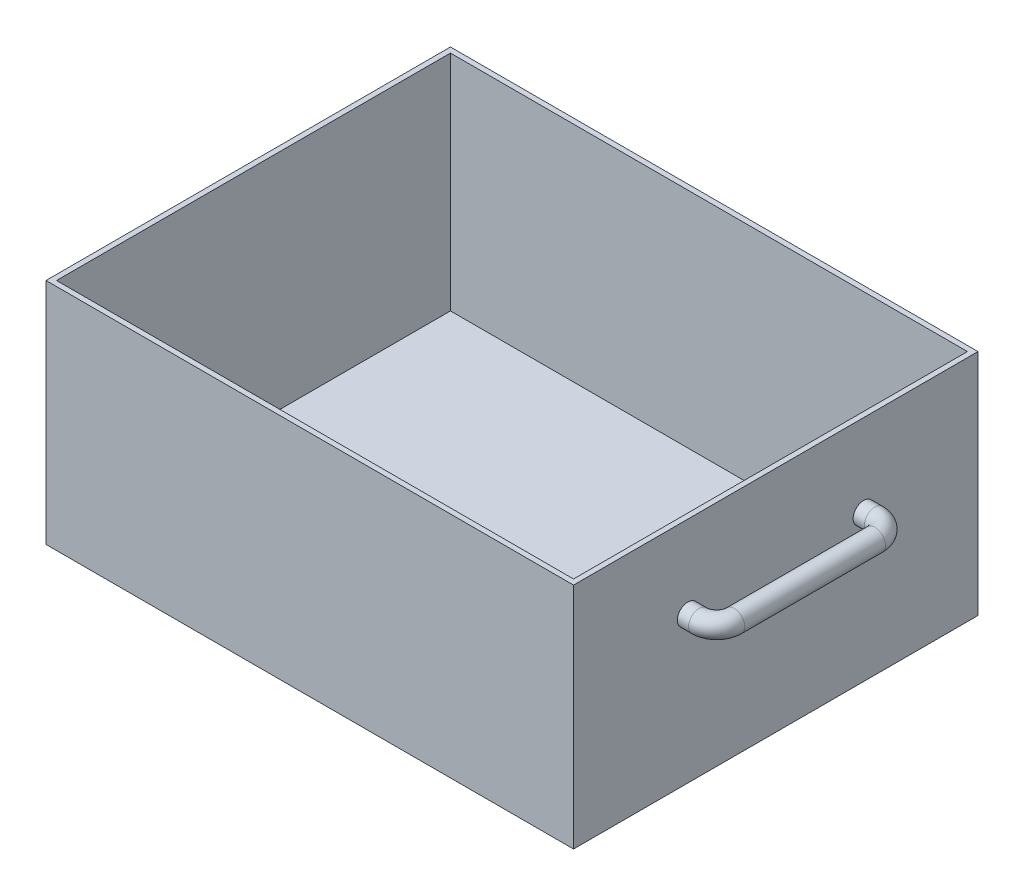
ISO-10303-21;
HEADER;
FILE_DESCRIPTION(('STEP AP214'),'2;1');
FILE_NAME('part.step','',(''),(''),'','','');
FILE_SCHEMA(('AUTOMOTIVE_DESIGN { 1 0 10303 214 1 1 1 1 }'));
ENDSEC;
DATA;
#1=APPLICATION_CONTEXT('core data for automotive mechanical design processes');
#2=APPLICATION_PROTOCOL_DEFINITION('international standard','automotive_design',2000,#1);
#3=PRODUCT_CONTEXT('',#1,'mechanical');
#4=PRODUCT('Part','Part','',(#3));
#5=PRODUCT_RELATED_PRODUCT_CATEGORY('part','',(#4));
#6=PRODUCT_DEFINITION_FORMATION('','',#4);
#7=PRODUCT_DEFINITION_CONTEXT('part definition',#1,'design');
#8=PRODUCT_DEFINITION('design','',#6,#7);
#9=PRODUCT_DEFINITION_SHAPE('','',#8);
#10=(LENGTH_UNIT() NAMED_UNIT(*) SI_UNIT(.MILLI.,.METRE.));
#11=(NAMED_UNIT(*) PLANE_ANGLE_UNIT() SI_UNIT($,.RADIAN.));
#12=(NAMED_UNIT(*) SI_UNIT($,.STERADIAN.) SOLID_ANGLE_UNIT());
#13=UNCERTAINTY_MEASURE_WITH_UNIT(LENGTH_MEASURE(1.E-05),#10,'distance_accuracy_value','');
#14=(GEOMETRIC_REPRESENTATION_CONTEXT(3) GLOBAL_UNCERTAINTY_ASSIGNED_CONTEXT((#13)) GLOBAL_UNIT_ASSIGNED_CONTEXT((#10,
#11,#12)) REPRESENTATION_CONTEXT('',''));
#15=CARTESIAN_POINT('',(0.,0.,0.));
#16=DIRECTION('',(0.,0.,1.));
#17=DIRECTION('',(1.,0.,0.));
#18=AXIS2_PLACEMENT_3D('',#15,#16,#17);
#19=CARTESIAN_POINT('',(163.179916317992,130.,-119.874476987448));
#20=DIRECTION('',(-1.,0.,0.));
#21=DIRECTION('',(0.,0.,1.));
#22=AXIS2_PLACEMENT_3D('',#19,#20,#21);
#23=PLANE('',#22);
#24=DIRECTION('',(0.,0.,-1.));
#25=VECTOR('',#24,1.);
#26=CARTESIAN_POINT('',(163.179916317992,0.,-119.874476987448));
#27=LINE('',#26,#25);
#28=CARTESIAN_POINT('',(163.179916317992,0.,110.125523012552));
#29=VERTEX_POINT('',#28);
#30=CARTESIAN_POINT('',(163.179916317992,0.,-119.874476987448));
#31=VERTEX_POINT('',#30);
#32=EDGE_CURVE('E155',#29,#31,#27,.T.);
#33=ORIENTED_EDGE('',*,*,#32,.T.);
#34=DIRECTION('',(0.,-1.,0.));
#35=VECTOR('',#34,1.);
#36=CARTESIAN_POINT('',(163.179916317992,130.,-119.874476987448));
#37=LINE('',#36,#35);
#38=CARTESIAN_POINT('',(163.179916317992,130.,-119.874476987448));
#39=VERTEX_POINT('',#38);
#40=EDGE_CURVE('E159',#39,#31,#37,.T.);
#41=ORIENTED_EDGE('',*,*,#40,.F.);
#42=DIRECTION('',(0.,0.,-1.));
#43=VECTOR('',#42,1.);
#44=CARTESIAN_POINT('',(163.179916317992,130.,-119.874476987448));
#45=LINE('',#44,#43);
#46=CARTESIAN_POINT('',(163.179916317992,130.,110.125523012552));
#47=VERTEX_POINT('',#46);
#48=EDGE_CURVE('E146',#47,#39,#45,.T.);
#49=ORIENTED_EDGE('',*,*,#48,.F.);
#50=DIRECTION('',(0.,-1.,0.));
#51=VECTOR('',#50,1.);
#52=CARTESIAN_POINT('',(163.179916317992,130.,110.125523012552));
#53=LINE('',#52,#51);
#54=EDGE_CURVE('E160',#47,#29,#53,.T.);
#55=ORIENTED_EDGE('',*,*,#54,.T.);
#56=EDGE_LOOP('',(#33,#41,#49,#55));
#57=FACE_BOUND('',#56,.T.);
#58=CARTESIAN_POINT('',(163.179916317992,83.1723956839028,-54.8744769874477));
#59=DIRECTION('',(-1.,0.,0.));
#60=DIRECTION('',(0.,0.,1.));
#61=AXIS2_PLACEMENT_3D('',#58,#59,#60);
#62=CIRCLE('',#61,6.);
#63=CARTESIAN_POINT('',(163.179916317992,83.1723956839028,-48.8744769874477));
#64=VERTEX_POINT('',#63);
#65=EDGE_CURVE('E328',#64,#64,#62,.T.);
#66=ORIENTED_EDGE('',*,*,#65,.T.);
#67=EDGE_LOOP('',(#66));
#68=FACE_BOUND('',#67,.T.);
#69=CARTESIAN_POINT('',(163.179916317992,83.1723956839028,45.1255230125523));
#70=DIRECTION('',(1.,0.,0.));
#71=DIRECTION('',(0.,0.,-1.));
#72=AXIS2_PLACEMENT_3D('',#69,#70,#71);
#73=CIRCLE('',#72,6.);
#74=CARTESIAN_POINT('',(163.179916317992,83.1723956839028,39.1255230125523));
#75=VERTEX_POINT('',#74);
#76=EDGE_CURVE('E11',#75,#75,#73,.T.);
#77=ORIENTED_EDGE('',*,*,#76,.F.);
#78=EDGE_LOOP('',(#77));
#79=FACE_BOUND('',#78,.T.);
#80=ADVANCED_FACE('F33',(#57,#68,#79),#23,.F.);
#81=CARTESIAN_POINT('',(-136.820083682008,130.,-119.874476987448));
#82=DIRECTION('',(1.,0.,0.));
#83=DIRECTION('',(0.,0.,-1.));
#84=AXIS2_PLACEMENT_3D('',#81,#82,#83);
#85=PLANE('',#84);
#86=DIRECTION('',(0.,0.,1.));
#87=VECTOR('',#86,1.);
#88=CARTESIAN_POINT('',(-136.820083682008,0.,-119.874476987448));
#89=LINE('',#88,#87);
#90=CARTESIAN_POINT('',(-136.820083682008,0.,-119.874476987448));
#91=VERTEX_POINT('',#90);
#92=CARTESIAN_POINT('',(-136.820083682008,0.,110.125523012552));
#93=VERTEX_POINT('',#92);
#94=EDGE_CURVE('E150',#91,#93,#89,.T.);
#95=ORIENTED_EDGE('',*,*,#94,.T.);
#96=DIRECTION('',(0.,-1.,0.));
#97=VECTOR('',#96,1.);
#98=CARTESIAN_POINT('',(-136.820083682008,130.,110.125523012552));
#99=LINE('',#98,#97);
#100=CARTESIAN_POINT('',(-136.820083682008,130.,110.125523012552));
#101=VERTEX_POINT('',#100);
#102=EDGE_CURVE('E37',#101,#93,#99,.T.);
#103=ORIENTED_EDGE('',*,*,#102,.F.);
#104=DIRECTION('',(0.,0.,1.));
#105=VECTOR('',#104,1.);
#106=CARTESIAN_POINT('',(-136.820083682008,130.,-119.874476987448));
#107=LINE('',#106,#105);
#108=CARTESIAN_POINT('',(-136.820083682008,130.,-119.874476987448));
#109=VERTEX_POINT('',#108);
#110=EDGE_CURVE('E143',#109,#101,#107,.T.);
#111=ORIENTED_EDGE('',*,*,#110,.F.);
#112=DIRECTION('',(0.,-1.,0.));
#113=VECTOR('',#112,1.);
#114=CARTESIAN_POINT('',(-136.820083682008,130.,-119.874476987448));
#115=LINE('',#114,#113);
#116=EDGE_CURVE('E149',#109,#91,#115,.T.);
#117=ORIENTED_EDGE('',*,*,#116,.T.);
#118=EDGE_LOOP('',(#95,#103,#111,#117));
#119=FACE_BOUND('',#118,.T.);
#120=ADVANCED_FACE('F35',(#119),#85,.F.);
#121=CARTESIAN_POINT('',(-136.820083682008,130.,110.125523012552));
#122=DIRECTION('',(0.,0.,-1.));
#123=DIRECTION('',(-1.,0.,0.));
#124=AXIS2_PLACEMENT_3D('',#121,#122,#123);
#125=PLANE('',#124);
#126=DIRECTION('',(1.,0.,0.));
#127=VECTOR('',#126,1.);
#128=CARTESIAN_POINT('',(-136.820083682008,0.,110.125523012552));
#129=LINE('',#128,#127);
#130=EDGE_CURVE('E153',#93,#29,#129,.T.);
#131=ORIENTED_EDGE('',*,*,#130,.T.);
#132=ORIENTED_EDGE('',*,*,#54,.F.);
#133=DIRECTION('',(1.,0.,0.));
#134=VECTOR('',#133,1.);
#135=CARTESIAN_POINT('',(-136.820083682008,130.,110.125523012552));
#136=LINE('',#135,#134);
#137=EDGE_CURVE('E87',#101,#47,#136,.T.);
#138=ORIENTED_EDGE('',*,*,#137,.F.);
#139=ORIENTED_EDGE('',*,*,#102,.T.);
#140=EDGE_LOOP('',(#131,#132,#138,#139));
#141=FACE_BOUND('',#140,.T.);
#142=ADVANCED_FACE('F166',(#141),#125,.F.);
#143=CARTESIAN_POINT('',(-136.820083682008,130.,-119.874476987448));
#144=DIRECTION('',(0.,0.,1.));
#145=DIRECTION('',(1.,0.,0.));
#146=AXIS2_PLACEMENT_3D('',#143,#144,#145);
#147=PLANE('',#146);
#148=DIRECTION('',(-1.,0.,0.));
#149=VECTOR('',#148,1.);
#150=CARTESIAN_POINT('',(-136.820083682008,0.,-119.874476987448));
#151=LINE('',#150,#149);
#152=EDGE_CURVE('E79',#31,#91,#151,.T.);
#153=ORIENTED_EDGE('',*,*,#152,.T.);
#154=ORIENTED_EDGE('',*,*,#116,.F.);
#155=DIRECTION('',(-1.,0.,0.));
#156=VECTOR('',#155,1.);
#157=CARTESIAN_POINT('',(-136.820083682008,130.,-119.874476987448));
#158=LINE('',#157,#156);
#159=EDGE_CURVE('E58',#39,#109,#158,.T.);
#160=ORIENTED_EDGE('',*,*,#159,.F.);
#161=ORIENTED_EDGE('',*,*,#40,.T.);
#162=EDGE_LOOP('',(#153,#154,#160,#161));
#163=FACE_BOUND('',#162,.T.);
#164=ADVANCED_FACE('F174',(#163),#147,.F.);
#165=CARTESIAN_POINT('',(0.,130.,0.));
#166=DIRECTION('',(0.,1.,0.));
#167=DIRECTION('',(0.,0.,1.));
#168=AXIS2_PLACEMENT_3D('',#165,#166,#167);
#169=PLANE('',#168);
#170=DIRECTION('',(0.,0.,1.));
#171=VECTOR('',#170,1.);
#172=CARTESIAN_POINT('',(-133.820083682008,130.,-119.874476987448));
#173=LINE('',#172,#171);
#174=CARTESIAN_POINT('',(-133.820083682008,130.,-116.874476987448));
#175=VERTEX_POINT('',#174);
#176=CARTESIAN_POINT('',(-133.820083682008,130.,107.125523012552));
#177=VERTEX_POINT('',#176);
#178=EDGE_CURVE('E132',#175,#177,#173,.T.);
#179=ORIENTED_EDGE('',*,*,#178,.F.);
#180=DIRECTION('',(-1.,0.,0.));
#181=VECTOR('',#180,1.);
#182=CARTESIAN_POINT('',(-136.820083682008,130.,-116.874476987448));
#183=LINE('',#182,#181);
#184=CARTESIAN_POINT('',(160.179916317992,130.,-116.874476987448));
#185=VERTEX_POINT('',#184);
#186=EDGE_CURVE('E141',#185,#175,#183,.T.);
#187=ORIENTED_EDGE('',*,*,#186,.F.);
#188=DIRECTION('',(0.,0.,-1.));
#189=VECTOR('',#188,1.);
#190=CARTESIAN_POINT('',(160.179916317992,130.,-119.874476987448));
#191=LINE('',#190,#189);
#192=CARTESIAN_POINT('',(160.179916317992,130.,107.125523012552));
#193=VERTEX_POINT('',#192);
#194=EDGE_CURVE('E139',#193,#185,#191,.T.);
#195=ORIENTED_EDGE('',*,*,#194,.F.);
#196=DIRECTION('',(1.,0.,0.));
#197=VECTOR('',#196,1.);
#198=CARTESIAN_POINT('',(-136.820083682008,130.,107.125523012552));
#199=LINE('',#198,#197);
#200=EDGE_CURVE('E124',#177,#193,#199,.T.);
#201=ORIENTED_EDGE('',*,*,#200,.F.);
#202=EDGE_LOOP('',(#179,#187,#195,#201));
#203=FACE_BOUND('',#202,.T.);
#204=ORIENTED_EDGE('',*,*,#110,.T.);
#205=ORIENTED_EDGE('',*,*,#137,.T.);
#206=ORIENTED_EDGE('',*,*,#48,.T.);
#207=ORIENTED_EDGE('',*,*,#159,.T.);
#208=EDGE_LOOP('',(#204,#205,#206,#207));
#209=FACE_BOUND('',#208,.T.);
#210=ADVANCED_FACE('F175',(#203,#209),#169,.T.);
#211=CARTESIAN_POINT('',(0.,0.,0.));
#212=DIRECTION('',(0.,1.,0.));
#213=DIRECTION('',(0.,0.,1.));
#214=AXIS2_PLACEMENT_3D('',#211,#212,#213);
#215=PLANE('',#214);
#216=ORIENTED_EDGE('',*,*,#94,.F.);
#217=ORIENTED_EDGE('',*,*,#152,.F.);
#218=ORIENTED_EDGE('',*,*,#32,.F.);
#219=ORIENTED_EDGE('',*,*,#130,.F.);
#220=EDGE_LOOP('',(#216,#217,#218,#219));
#221=FACE_BOUND('',#220,.T.);
#222=ADVANCED_FACE('F171',(#221),#215,.F.);
#223=CARTESIAN_POINT('',(-133.820083682008,130.,-119.874476987448));
#224=DIRECTION('',(1.,0.,0.));
#225=DIRECTION('',(0.,0.,-1.));
#226=AXIS2_PLACEMENT_3D('',#223,#224,#225);
#227=PLANE('',#226);
#228=DIRECTION('',(0.,0.,1.));
#229=VECTOR('',#228,1.);
#230=CARTESIAN_POINT('',(-133.820083682008,3.,-119.874476987448));
#231=LINE('',#230,#229);
#232=CARTESIAN_POINT('',(-133.820083682008,3.,-116.874476987448));
#233=VERTEX_POINT('',#232);
#234=CARTESIAN_POINT('',(-133.820083682008,3.,107.125523012552));
#235=VERTEX_POINT('',#234);
#236=EDGE_CURVE('E115',#233,#235,#231,.T.);
#237=ORIENTED_EDGE('',*,*,#236,.F.);
#238=DIRECTION('',(0.,-1.,0.));
#239=VECTOR('',#238,1.);
#240=CARTESIAN_POINT('',(-133.820083682008,130.,-116.874476987448));
#241=LINE('',#240,#239);
#242=EDGE_CURVE('E135',#175,#233,#241,.T.);
#243=ORIENTED_EDGE('',*,*,#242,.F.);
#244=ORIENTED_EDGE('',*,*,#178,.T.);
#245=DIRECTION('',(0.,-1.,0.));
#246=VECTOR('',#245,1.);
#247=CARTESIAN_POINT('',(-133.820083682008,130.,107.125523012552));
#248=LINE('',#247,#246);
#249=EDGE_CURVE('E127',#177,#235,#248,.T.);
#250=ORIENTED_EDGE('',*,*,#249,.T.);
#251=EDGE_LOOP('',(#237,#243,#244,#250));
#252=FACE_BOUND('',#251,.T.);
#253=ADVANCED_FACE('F183',(#252),#227,.T.);
#254=CARTESIAN_POINT('',(-136.820083682008,130.,107.125523012552));
#255=DIRECTION('',(0.,0.,-1.));
#256=DIRECTION('',(-1.,0.,0.));
#257=AXIS2_PLACEMENT_3D('',#254,#255,#256);
#258=PLANE('',#257);
#259=DIRECTION('',(1.,0.,0.));
#260=VECTOR('',#259,1.);
#261=CARTESIAN_POINT('',(-136.820083682008,3.,107.125523012552));
#262=LINE('',#261,#260);
#263=CARTESIAN_POINT('',(160.179916317992,3.,107.125523012552));
#264=VERTEX_POINT('',#263);
#265=EDGE_CURVE('E109',#235,#264,#262,.T.);
#266=ORIENTED_EDGE('',*,*,#265,.F.);
#267=ORIENTED_EDGE('',*,*,#249,.F.);
#268=ORIENTED_EDGE('',*,*,#200,.T.);
#269=DIRECTION('',(0.,-1.,0.));
#270=VECTOR('',#269,1.);
#271=CARTESIAN_POINT('',(160.179916317992,130.,107.125523012552));
#272=LINE('',#271,#270);
#273=EDGE_CURVE('E121',#193,#264,#272,.T.);
#274=ORIENTED_EDGE('',*,*,#273,.T.);
#275=EDGE_LOOP('',(#266,#267,#268,#274));
#276=FACE_BOUND('',#275,.T.);
#277=ADVANCED_FACE('F122',(#276),#258,.T.);
#278=CARTESIAN_POINT('',(160.179916317992,130.,-119.874476987448));
#279=DIRECTION('',(-1.,0.,0.));
#280=DIRECTION('',(0.,0.,1.));
#281=AXIS2_PLACEMENT_3D('',#278,#279,#280);
#282=PLANE('',#281);
#283=DIRECTION('',(0.,0.,-1.));
#284=VECTOR('',#283,1.);
#285=CARTESIAN_POINT('',(160.179916317992,3.,-119.874476987448));
#286=LINE('',#285,#284);
#287=CARTESIAN_POINT('',(160.179916317992,3.,-116.874476987448));
#288=VERTEX_POINT('',#287);
#289=EDGE_CURVE('E113',#264,#288,#286,.T.);
#290=ORIENTED_EDGE('',*,*,#289,.F.);
#291=ORIENTED_EDGE('',*,*,#273,.F.);
#292=ORIENTED_EDGE('',*,*,#194,.T.);
#293=DIRECTION('',(0.,-1.,0.));
#294=VECTOR('',#293,1.);
#295=CARTESIAN_POINT('',(160.179916317992,130.,-116.874476987448));
#296=LINE('',#295,#294);
#297=EDGE_CURVE('E49',#185,#288,#296,.T.);
#298=ORIENTED_EDGE('',*,*,#297,.T.);
#299=EDGE_LOOP('',(#290,#291,#292,#298));
#300=FACE_BOUND('',#299,.T.);
#301=ADVANCED_FACE('F129',(#300),#282,.T.);
#302=CARTESIAN_POINT('',(-136.820083682008,130.,-116.874476987448));
#303=DIRECTION('',(0.,0.,1.));
#304=DIRECTION('',(1.,0.,0.));
#305=AXIS2_PLACEMENT_3D('',#302,#303,#304);
#306=PLANE('',#305);
#307=DIRECTION('',(-1.,0.,0.));
#308=VECTOR('',#307,1.);
#309=CARTESIAN_POINT('',(-136.820083682008,3.,-116.874476987448));
#310=LINE('',#309,#308);
#311=EDGE_CURVE('E130',#288,#233,#310,.T.);
#312=ORIENTED_EDGE('',*,*,#311,.F.);
#313=ORIENTED_EDGE('',*,*,#297,.F.);
#314=ORIENTED_EDGE('',*,*,#186,.T.);
#315=ORIENTED_EDGE('',*,*,#242,.T.);
#316=EDGE_LOOP('',(#312,#313,#314,#315));
#317=FACE_BOUND('',#316,.T.);
#318=ADVANCED_FACE('F238',(#317),#306,.T.);
#319=CARTESIAN_POINT('',(0.,3.,0.));
#320=DIRECTION('',(0.,1.,0.));
#321=DIRECTION('',(0.,0.,1.));
#322=AXIS2_PLACEMENT_3D('',#319,#320,#321);
#323=PLANE('',#322);
#324=ORIENTED_EDGE('',*,*,#236,.T.);
#325=ORIENTED_EDGE('',*,*,#265,.T.);
#326=ORIENTED_EDGE('',*,*,#289,.T.);
#327=ORIENTED_EDGE('',*,*,#311,.T.);
#328=EDGE_LOOP('',(#324,#325,#326,#327));
#329=FACE_BOUND('',#328,.T.);
#330=ADVANCED_FACE('F111',(#329),#323,.T.);
#331=CARTESIAN_POINT('',(169.565605173622,83.1723956839028,-54.8744769874477));
#332=DIRECTION('',(-1.,0.,0.));
#333=DIRECTION('',(0.,0.,1.));
#334=AXIS2_PLACEMENT_3D('',#331,#332,#333);
#335=CYLINDRICAL_SURFACE('',#334,6.);
#336=CARTESIAN_POINT('',(169.565605173622,83.1723956839028,-54.8744769874477));
#337=DIRECTION('',(-1.,0.,0.));
#338=DIRECTION('',(0.,0.,1.));
#339=AXIS2_PLACEMENT_3D('',#336,#337,#338);
#340=CIRCLE('',#339,6.);
#341=CARTESIAN_POINT('',(169.565605173622,83.1723956839028,-60.8744769874477));
#342=VERTEX_POINT('',#341);
#343=EDGE_CURVE('E325',#342,#342,#340,.T.);
#344=ORIENTED_EDGE('',*,*,#343,.T.);
#345=EDGE_LOOP('',(#344));
#346=FACE_BOUND('',#345,.T.);
#347=ORIENTED_EDGE('',*,*,#65,.F.);
#348=EDGE_LOOP('',(#347));
#349=FACE_BOUND('',#348,.T.);
#350=ADVANCED_FACE('F254',(#346,#349),#335,.T.);
#351=CARTESIAN_POINT('',(169.565605173622,83.1723956839028,-44.8744769874477));
#352=DIRECTION('',(0.,1.,0.));
#353=DIRECTION('',(0.,0.,1.));
#354=AXIS2_PLACEMENT_3D('',#351,#352,#353);
#355=TOROIDAL_SURFACE('',#354,9.99999999999998,6.);
#356=CARTESIAN_POINT('',(179.565605173622,83.1723956839028,-44.8744769874477));
#357=DIRECTION('',(0.,0.,-1.));
#358=DIRECTION('',(-1.,0.,0.));
#359=AXIS2_PLACEMENT_3D('',#356,#357,#358);
#360=CIRCLE('',#359,6.);
#361=CARTESIAN_POINT('',(185.565605173622,83.1723956839028,-44.8744769874476));
#362=VERTEX_POINT('',#361);
#363=EDGE_CURVE('E320',#362,#362,#360,.T.);
#364=CARTESIAN_POINT('',(169.565605173622,83.1723956839028,-44.8744769874477));
#365=DIRECTION('',(0.,1.,0.));
#366=DIRECTION('',(0.,0.,1.));
#367=AXIS2_PLACEMENT_3D('',#364,#365,#366);
#368=CIRCLE('',#367,16.);
#369=EDGE_CURVE('',#362,#342,#368,.T.);
#370=ORIENTED_EDGE('',*,*,#363,.T.);
#371=ORIENTED_EDGE('',*,*,#343,.F.);
#372=ORIENTED_EDGE('',*,*,#369,.T.);
#373=ORIENTED_EDGE('',*,*,#369,.F.);
#374=EDGE_LOOP('',(#370,#372,#371,#373));
#375=FACE_BOUND('',#374,.T.);
#376=ADVANCED_FACE('F267',(#375),#355,.T.);
#377=CARTESIAN_POINT('',(179.565605173622,83.1723956839028,35.1255230125523));
#378=DIRECTION('',(0.,0.,-1.));
#379=DIRECTION('',(-1.,0.,0.));
#380=AXIS2_PLACEMENT_3D('',#377,#378,#379);
#381=CYLINDRICAL_SURFACE('',#380,6.);
#382=CARTESIAN_POINT('',(179.565605173622,83.1723956839028,35.1255230125523));
#383=DIRECTION('',(0.,0.,-1.));
#384=DIRECTION('',(-1.,0.,0.));
#385=AXIS2_PLACEMENT_3D('',#382,#383,#384);
#386=CIRCLE('',#385,6.);
#387=CARTESIAN_POINT('',(185.565605173622,83.1723956839028,35.1255230125523));
#388=VERTEX_POINT('',#387);
#389=EDGE_CURVE('E317',#388,#388,#386,.T.);
#390=ORIENTED_EDGE('',*,*,#389,.T.);
#391=EDGE_LOOP('',(#390));
#392=FACE_BOUND('',#391,.T.);
#393=ORIENTED_EDGE('',*,*,#363,.F.);
#394=EDGE_LOOP('',(#393));
#395=FACE_BOUND('',#394,.T.);
#396=ADVANCED_FACE('F277',(#392,#395),#381,.T.);
#397=CARTESIAN_POINT('',(169.565605173622,83.1723956839028,35.1255230125523));
#398=DIRECTION('',(0.,1.,0.));
#399=DIRECTION('',(0.,0.,1.));
#400=AXIS2_PLACEMENT_3D('',#397,#398,#399);
#401=TOROIDAL_SURFACE('',#400,10.,6.);
#402=CARTESIAN_POINT('',(169.565605173622,83.1723956839028,45.1255230125523));
#403=DIRECTION('',(1.,0.,0.));
#404=DIRECTION('',(0.,0.,-1.));
#405=AXIS2_PLACEMENT_3D('',#402,#403,#404);
#406=CIRCLE('',#405,6.);
#407=CARTESIAN_POINT('',(169.565605173622,83.1723956839028,51.1255230125523));
#408=VERTEX_POINT('',#407);
#409=EDGE_CURVE('E314',#408,#408,#406,.T.);
#410=CARTESIAN_POINT('',(169.565605173622,83.1723956839028,35.1255230125523));
#411=DIRECTION('',(0.,1.,0.));
#412=DIRECTION('',(0.,0.,1.));
#413=AXIS2_PLACEMENT_3D('',#410,#411,#412);
#414=CIRCLE('',#413,16.);
#415=EDGE_CURVE('',#408,#388,#414,.T.);
#416=ORIENTED_EDGE('',*,*,#409,.T.);
#417=ORIENTED_EDGE('',*,*,#389,.F.);
#418=ORIENTED_EDGE('',*,*,#415,.T.);
#419=ORIENTED_EDGE('',*,*,#415,.F.);
#420=EDGE_LOOP('',(#416,#418,#417,#419));
#421=FACE_BOUND('',#420,.T.);
#422=ADVANCED_FACE('F287',(#421),#401,.T.);
#423=CARTESIAN_POINT('',(169.565605173622,83.1723956839028,45.1255230125523));
#424=DIRECTION('',(-1.,0.,0.));
#425=DIRECTION('',(0.,0.,1.));
#426=AXIS2_PLACEMENT_3D('',#423,#424,#425);
#427=CYLINDRICAL_SURFACE('',#426,6.);
#428=ORIENTED_EDGE('',*,*,#409,.F.);
#429=EDGE_LOOP('',(#428));
#430=FACE_BOUND('',#429,.T.);
#431=ORIENTED_EDGE('',*,*,#76,.T.);
#432=EDGE_LOOP('',(#431));
#433=FACE_BOUND('',#432,.T.);
#434=ADVANCED_FACE('F297',(#430,#433),#427,.T.);
#435=CLOSED_SHELL('',(#80,#120,#142,#164,#210,#222,#253,#277,#301,#318,#330,#350,#376,#396,#422,#434));
#436=MANIFOLD_SOLID_BREP('B2',#435);
#437=ADVANCED_BREP_SHAPE_REPRESENTATION('',(#18,#436),#14);
#438=SHAPE_DEFINITION_REPRESENTATION(#9,#437);
ENDSEC;
END-ISO-10303-21;
